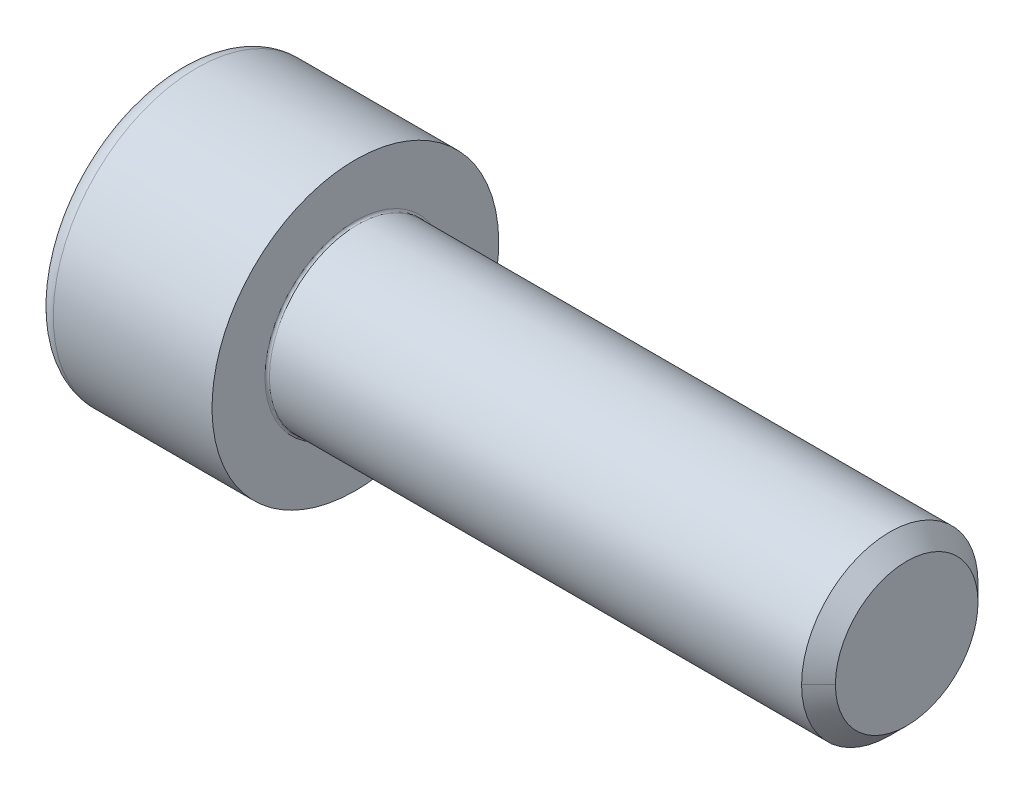
ISO-10303-21;
HEADER;
FILE_DESCRIPTION(('STEP AP214'),'2;1');
FILE_NAME('part.step','',(''),(''),'','','');
FILE_SCHEMA(('AUTOMOTIVE_DESIGN { 1 0 10303 214 1 1 1 1 }'));
ENDSEC;
DATA;
#1=APPLICATION_CONTEXT('core data for automotive mechanical design processes');
#2=APPLICATION_PROTOCOL_DEFINITION('international standard','automotive_design',2000,#1);
#3=PRODUCT_CONTEXT('',#1,'mechanical');
#4=PRODUCT('Part','Part','',(#3));
#5=PRODUCT_RELATED_PRODUCT_CATEGORY('part','',(#4));
#6=PRODUCT_DEFINITION_FORMATION('','',#4);
#7=PRODUCT_DEFINITION_CONTEXT('part definition',#1,'design');
#8=PRODUCT_DEFINITION('design','',#6,#7);
#9=PRODUCT_DEFINITION_SHAPE('','',#8);
#10=(LENGTH_UNIT() NAMED_UNIT(*) SI_UNIT(.MILLI.,.METRE.));
#11=(NAMED_UNIT(*) PLANE_ANGLE_UNIT() SI_UNIT($,.RADIAN.));
#12=(NAMED_UNIT(*) SI_UNIT($,.STERADIAN.) SOLID_ANGLE_UNIT());
#13=UNCERTAINTY_MEASURE_WITH_UNIT(LENGTH_MEASURE(1.E-05),#10,'distance_accuracy_value','');
#14=(GEOMETRIC_REPRESENTATION_CONTEXT(3) GLOBAL_UNCERTAINTY_ASSIGNED_CONTEXT((#13)) GLOBAL_UNIT_ASSIGNED_CONTEXT((#10,
#11,#12)) REPRESENTATION_CONTEXT('',''));
#15=CARTESIAN_POINT('',(0.,0.,0.));
#16=DIRECTION('',(0.,0.,1.));
#17=DIRECTION('',(1.,0.,0.));
#18=AXIS2_PLACEMENT_3D('',#15,#16,#17);
#19=CARTESIAN_POINT('',(-2.,0.,0.));
#20=CARTESIAN_POINT('',(-4.012,0.,-3.484886225));
#21=(BOUNDED_CURVE() B_SPLINE_CURVE(1,(#19,#20),.UNSPECIFIED.,.F.,
.F.) B_SPLINE_CURVE_WITH_KNOTS((2,2),(0.,1.),
.UNSPECIFIED.) CURVE() GEOMETRIC_REPRESENTATION_ITEM() RATIONAL_B_SPLINE_CURVE((1.,1.)) REPRESENTATION_ITEM(''));
#22=CARTESIAN_POINT('',(995.988,0.,0.));
#23=DIRECTION('',(-1.,0.,0.));
#24=AXIS1_PLACEMENT('',#22,#23);
#25=SURFACE_OF_REVOLUTION('',#21,#24);
#26=CARTESIAN_POINT('',(-2.,0.,0.));
#27=VERTEX_POINT('',#26);
#28=VERTEX_LOOP('',#27);
#29=FACE_BOUND('',#28,.T.);
#30=CARTESIAN_POINT('',(-3.99999999984062,-3.,1.73205080735758));
#31=CARTESIAN_POINT('',(-3.97851489193875,-3.,1.65761808052019));
#32=CARTESIAN_POINT('',(-3.95798309838539,-3.,1.58290190663716));
#33=CARTESIAN_POINT('',(-3.91907032719949,-3.,1.43282848850523));
#34=CARTESIAN_POINT('',(-3.90069164714427,-3.,1.35747064985167));
#35=CARTESIAN_POINT('',(-3.8663707665415,-3.,1.20617474089734));
#36=CARTESIAN_POINT('',(-3.85042929047177,-3.,1.13023650508519));
#37=CARTESIAN_POINT('',(-3.82128811879882,-3.,0.977967996741173));
#38=CARTESIAN_POINT('',(-3.8080837718789,-3.,0.901638618944881));
#39=CARTESIAN_POINT('',(-3.78464494856391,-3.,0.748542880651708));
#40=CARTESIAN_POINT('',(-3.77440966493625,-3.,0.671776644726642));
#41=CARTESIAN_POINT('',(-3.75712933263816,-3.,0.517888466866818));
#42=CARTESIAN_POINT('',(-3.75008415629625,-3.,0.440766539292025));
#43=CARTESIAN_POINT('',(-3.73758761921871,-3.,0.260800031229109));
#44=CARTESIAN_POINT('',(-3.73342857884957,-3.,0.157862092212769));
#45=CARTESIAN_POINT('',(-3.73125246220861,-3.,-0.0481162220831747));
#46=CARTESIAN_POINT('',(-3.73323773909754,-3.,-0.151156621496689));
#47=CARTESIAN_POINT('',(-3.74326251019377,-3.,-0.356939780443612));
#48=CARTESIAN_POINT('',(-3.75130205013777,-3.,-0.459682537722608));
#49=CARTESIAN_POINT('',(-3.77307973368925,-3.,-0.66450644773767));
#50=CARTESIAN_POINT('',(-3.78681525038384,-3.,-0.76658788345444));
#51=CARTESIAN_POINT('',(-3.81944899427639,-3.,-0.969910147319328));
#52=CARTESIAN_POINT('',(-3.83834714010404,-3.,-1.07115098869048));
#53=CARTESIAN_POINT('',(-3.88067496383595,-3.,-1.27264427345005));
#54=CARTESIAN_POINT('',(-3.90410334964981,-3.,-1.37289699011778));
#55=CARTESIAN_POINT('',(-3.94053485450444,-3.,-1.51609633056627));
#56=CARTESIAN_POINT('',(-3.95195924232178,-3.,-1.55945231627273));
#57=CARTESIAN_POINT('',(-3.97548303567339,-3.,-1.64591951087093));
#58=CARTESIAN_POINT('',(-3.98758153125938,-3.,-1.68903096714322));
#59=CARTESIAN_POINT('',(-3.99999999990208,-3.,-1.73205080757046));
#60=B_SPLINE_CURVE_WITH_KNOTS('',3,(#30,#31,#32,#33,#34,#35,#36,#37,#38,#39,#40,#41,#42,#43,#44,
#45,#46,#47,#48,#49,#50,#51,#52,#53,#54,#55,#56,#57,#58,#59),.UNSPECIFIED.,.F.,.F.,(4,2,2,2,2,2,
2,2,2,2,2,2,2,2,4),(0.,0.232420113380513,0.465086024657071,0.697820963770005,0.93015710451819,
1.16243001809751,1.39469363504717,1.70357230484059,2.01256928413323,2.32156859775501,
2.63042556298281,2.93927766047031,3.24804179842969,3.38254521310348,3.51687127037881),.UNSPECIFIED.);
#61=CARTESIAN_POINT('',(-3.99999999992627,-2.99999999997875,1.73205080769106));
#62=VERTEX_POINT('',#61);
#63=CARTESIAN_POINT('',(-3.99999999962119,-2.99999999988657,-1.73205080806549));
#64=VERTEX_POINT('',#63);
#65=EDGE_CURVE('E135',#62,#64,#60,.T.);
#66=ORIENTED_EDGE('',*,*,#65,.F.);
#67=CARTESIAN_POINT('',(-3.99999999957588,-7.38635641571954E-10,3.46410161457355));
#68=CARTESIAN_POINT('',(-3.97851489168713,-0.0644606330526756,3.42688525116713));
#69=CARTESIAN_POINT('',(-3.95798309814725,-0.129166737708852,3.38952716423794));
#70=CARTESIAN_POINT('',(-3.91907032698901,-0.259134130243514,3.31449045519683));
#71=CARTESIAN_POINT('',(-3.90069164694797,-0.32439593289154,3.27681153588256));
#72=CARTESIAN_POINT('',(-3.86637076637425,-0.455422033533953,3.20116358143065));
#73=CARTESIAN_POINT('',(-3.8504292903194,-0.521186474865402,3.1631944635373));
#74=CARTESIAN_POINT('',(-3.82128811867685,-0.653054871285987,3.08706020939127));
#75=CARTESIAN_POINT('',(-3.80808377177244,-0.719158051511383,3.04889552050639));
#76=CARTESIAN_POINT('',(-3.78464494848871,-0.851742850081483,2.97234765138663));
#77=CARTESIAN_POINT('',(-3.7744096648768,-0.918224360543831,2.93396453343767));
#78=CARTESIAN_POINT('',(-3.75712933261013,-1.05149543190867,2.85702044453526));
#79=CARTESIAN_POINT('',(-3.7500841562839,-1.11828498037507,2.8184594807618));
#80=CARTESIAN_POINT('',(-3.73758761924036,-1.27414054820655,2.72847622674914));
#81=CARTESIAN_POINT('',(-3.73342857889102,-1.36328741842863,2.67700725724592));
#82=CARTESIAN_POINT('',(-3.73125246229145,-1.541669871278,2.57401810010845));
#83=CARTESIAN_POINT('',(-3.733237739202,-1.63090547480589,2.52249790040725));
#84=CARTESIAN_POINT('',(-3.74326251034196,-1.80911891816321,2.41960632094548));
#85=CARTESIAN_POINT('',(-3.75130205030807,-1.89809675604027,2.36823494231212));
#86=CARTESIAN_POINT('',(-3.77307973390372,-2.07547946545202,2.2658229873173));
#87=CARTESIAN_POINT('',(-3.78681525062037,-2.16388458205519,2.21478226946549));
#88=CARTESIAN_POINT('',(-3.81944899455595,-2.33996682775162,2.11312113754653));
#89=CARTESIAN_POINT('',(-3.83834714040457,-2.42764396829638,2.06250071686786));
#90=CARTESIAN_POINT('',(-3.88067496417706,-2.60214227162324,1.96175407450205));
#91=CARTESIAN_POINT('',(-3.90410335001053,-2.68896367107218,1.91162771617525));
#92=CARTESIAN_POINT('',(-3.94053485484528,-2.81297793756851,1.84002804605376));
#93=CARTESIAN_POINT('',(-3.95195924262051,-2.85052532244375,1.81835005329579));
#94=CARTESIAN_POINT('',(-3.97548303588198,-2.9254081092561,1.77511645618621));
#95=CARTESIAN_POINT('',(-3.98758153141995,-2.96274372543106,1.75356072814432));
#96=CARTESIAN_POINT('',(-4.00000000001191,-2.99999999995749,1.73205080802454));
#97=B_SPLINE_CURVE_WITH_KNOTS('',3,(#67,#68,#69,#70,#71,#72,#73,#74,#75,#76,#77,#78,#79,#80,#81,
#82,#83,#84,#85,#86,#87,#88,#89,#90,#91,#92,#93,#94,#95,#96),.UNSPECIFIED.,.F.,.F.,(4,2,2,2,2,2,
2,2,2,2,2,2,2,2,4),(0.,0.232420113351682,0.465086024599276,0.697820963683193,0.930157104400625,
1.16243001794921,1.3946936348681,1.70357230470536,2.012569284042,2.32156859770795,
2.6304255629803,2.93927766051221,3.24804179851589,3.38254521263582,3.5168712693585),.UNSPECIFIED.);
#98=CARTESIAN_POINT('',(-3.99999999979384,-7.104993349707E-10,3.46410161541021));
#99=VERTEX_POINT('',#98);
#100=EDGE_CURVE('E57',#99,#62,#97,.T.);
#101=ORIENTED_EDGE('',*,*,#100,.F.);
#102=CARTESIAN_POINT('',(-4.00000000005976,3.00000000010105,1.73205080794166));
#103=CARTESIAN_POINT('',(-3.97851489215166,2.93553936777582,1.76926717135454));
#104=CARTESIAN_POINT('',(-3.95798309859197,2.8708332631084,1.80662525829022));
#105=CARTESIAN_POINT('',(-3.91907032739323,2.74086587055095,1.88166196734449));
#106=CARTESIAN_POINT('',(-3.90069164733149,2.67560406789139,1.91934088666541));
#107=CARTESIAN_POINT('',(-3.86637076671553,2.54457796722554,1.99498884113086));
#108=CARTESIAN_POINT('',(-3.85042929063914,2.47881352588219,2.03295795903108));
#109=CARTESIAN_POINT('',(-3.82128811895272,2.34694512943654,2.10909221319157));
#110=CARTESIAN_POINT('',(-3.808083772026,2.28084194919798,2.14725690208406));
#111=CARTESIAN_POINT('',(-3.78464494869751,2.14825715060089,2.2238047712194));
#112=CARTESIAN_POINT('',(-3.77440966506314,2.08177564012473,2.26218788917634));
#113=CARTESIAN_POINT('',(-3.75712933275194,1.94850456873147,2.33913197809515));
#114=CARTESIAN_POINT('',(-3.75008415640363,1.88171502025047,2.37769294187705));
#115=CARTESIAN_POINT('',(-3.73758761931226,1.72585945241781,2.46767619589038));
#116=CARTESIAN_POINT('',(-3.73342857893519,1.636712582209,2.51914516538595));
#117=CARTESIAN_POINT('',(-3.73125246227814,1.45833012938471,2.62213432250893));
#118=CARTESIAN_POINT('',(-3.73323773915892,1.36909452586866,2.6736545222033));
#119=CARTESIAN_POINT('',(-3.74326251023896,1.19088108253351,2.77654610165227));
#120=CARTESIAN_POINT('',(-3.75130205017491,1.1019032446668,2.82791748027965));
#121=CARTESIAN_POINT('',(-3.77307973371073,0.924520535274668,2.93032943526315));
#122=CARTESIAN_POINT('',(-3.78681525039768,0.836115418680768,2.98137015310961));
#123=CARTESIAN_POINT('',(-3.81944899427565,0.660033173001847,3.08303128501846));
#124=CARTESIAN_POINT('',(-3.83834714009636,0.572356032465338,3.13365170569236));
#125=CARTESIAN_POINT('',(-3.88067496381504,0.397857729154355,3.234398348049));
#126=CARTESIAN_POINT('',(-3.90410334962262,0.311036329713043,3.2845247063714));
#127=CARTESIAN_POINT('',(-3.94053485447622,0.187022063042391,3.35612437659354));
#128=CARTESIAN_POINT('',(-3.9519592422989,0.149474677986129,3.37780236945602));
#129=CARTESIAN_POINT('',(-3.97548303566214,0.0745918908136653,3.42103596677351));
#130=CARTESIAN_POINT('',(-3.98758153125442,0.0372562744596169,3.4425916949188));
#131=CARTESIAN_POINT('',(-3.9999999999038,-2.45131167179603E-10,3.46410161514153));
#132=B_SPLINE_CURVE_WITH_KNOTS('',3,(#102,#103,#104,#105,#106,#107,#108,#109,#110,#111,#112,
#113,#114,#115,#116,#117,#118,#119,#120,#121,#122,#123,#124,#125,#126,#127,#128,#129,#130,#131),
.UNSPECIFIED.,.F.,.F.,(4,2,2,2,2,2,2,2,2,2,2,2,2,2,4),(0.,0.232420113405036,0.465086024706195,
0.697820963843758,0.930157104617576,1.16243001822251,1.39469363519779,1.70357230499265,
2.01256928428666,2.32156859790978,2.63042556313837,2.93927766062672,3.24804179858691,
3.38254521334941,3.51687127071333),.UNSPECIFIED.);
#133=CARTESIAN_POINT('',(-3.99999999967584,3.00000000005053,1.73205080797083));
#134=VERTEX_POINT('',#133);
#135=EDGE_CURVE('E555',#134,#99,#132,.T.);
#136=ORIENTED_EDGE('',*,*,#135,.F.);
#137=CARTESIAN_POINT('',(-3.99999999994993,3.,-1.73205080773623));
#138=CARTESIAN_POINT('',(-3.97851489204373,3.,-1.65761808089599));
#139=CARTESIAN_POINT('',(-3.95798309848593,3.,-1.58290190701009));
#140=CARTESIAN_POINT('',(-3.91907032729093,3.,-1.43282848887236));
#141=CARTESIAN_POINT('',(-3.90069164723105,3.,-1.35747065021586));
#142=CARTESIAN_POINT('',(-3.86637076661874,3.,-1.20617474125556));
#143=CARTESIAN_POINT('',(-3.85042929054414,3.,-1.13023650544038));
#144=CARTESIAN_POINT('',(-3.82128811886125,3.,-0.977967997089835));
#145=CARTESIAN_POINT('',(-3.80808377193626,3.,-0.901638619290043));
#146=CARTESIAN_POINT('',(-3.78464494861112,3.,-0.748542880989702));
#147=CARTESIAN_POINT('',(-3.77440966497836,3.,-0.671776645060969));
#148=CARTESIAN_POINT('',(-3.75712933267019,3.,-0.5178884671936));
#149=CARTESIAN_POINT('',(-3.75008415632331,3.,-0.440766539614931));
#150=CARTESIAN_POINT('',(-3.73758761923494,3.,-0.26080003155157));
#151=CARTESIAN_POINT('',(-3.73342857885949,3.,-0.157862092538618));
#152=CARTESIAN_POINT('',(-3.73125246220557,3.,0.048116221750925));
#153=CARTESIAN_POINT('',(-3.73323773908787,3.,0.151156621161426));
#154=CARTESIAN_POINT('',(-3.74326251017062,3.,0.356939780102711));
#155=CARTESIAN_POINT('',(-3.75130205010776,3.,0.459682537379084));
#156=CARTESIAN_POINT('',(-3.77307973364571,3.,0.664506447389037));
#157=CARTESIAN_POINT('',(-3.78681525033359,3.,0.766587883103323));
#158=CARTESIAN_POINT('',(-3.81944899421315,3.,0.969910146963494));
#159=CARTESIAN_POINT('',(-3.83834714003452,3.,1.07115098833242));
#160=CARTESIAN_POINT('',(-3.88067496375425,3.,1.27264427308768));
#161=CARTESIAN_POINT('',(-3.90410334956221,3.,1.37289698975335));
#162=CARTESIAN_POINT('',(-3.94053485440846,3.,1.51609633019774));
#163=CARTESIAN_POINT('',(-3.95195924222308,3.,1.55945231590215));
#164=CARTESIAN_POINT('',(-3.97548303556933,3.,1.64591951049628));
#165=CARTESIAN_POINT('',(-3.98758153115268,3.,1.68903096676657));
#166=CARTESIAN_POINT('',(-3.99999999979277,3.,1.73205080719181));
#167=B_SPLINE_CURVE_WITH_KNOTS('',3,(#137,#138,#139,#140,#141,#142,#143,#144,#145,#146,#147,
#148,#149,#150,#151,#152,#153,#154,#155,#156,#157,#158,#159,#160,#161,#162,#163,#164,#165,#166),
.UNSPECIFIED.,.F.,.F.,(4,2,2,2,2,2,2,2,2,2,2,2,2,2,4),(0.,0.232420113392348,0.465086024680793,
0.697820963805631,0.930157104566755,1.162430018159,1.3946936351216,1.70357230490566,
2.01256928418888,2.32156859780122,2.63042556301892,2.93927766049637,3.24804179844566,
3.38254521311141,3.51687127037881),.UNSPECIFIED.);
#168=CARTESIAN_POINT('',(-3.99999999962093,3.,-1.73205080786812));
#169=VERTEX_POINT('',#168);
#170=EDGE_CURVE('E149',#169,#134,#167,.T.);
#171=ORIENTED_EDGE('',*,*,#170,.F.);
#172=CARTESIAN_POINT('',(-3.99999999977573,1.39081131062023E-10,-3.4641016149197));
#173=CARTESIAN_POINT('',(-3.97851489187896,0.0644606324576882,-3.42688525151064));
#174=CARTESIAN_POINT('',(-3.95798309833089,0.129166737118463,-3.3895271645788));
#175=CARTESIAN_POINT('',(-3.91907032715594,0.259134129662445,-3.31449045553231));
#176=CARTESIAN_POINT('',(-3.90069164710637,0.324395932315195,-3.27681153621532));
#177=CARTESIAN_POINT('',(-3.86637076651528,0.455422032967204,-3.20116358175786));
#178=CARTESIAN_POINT('',(-3.85042929045156,0.521186474303528,-3.1631944638617));
#179=CARTESIAN_POINT('',(-3.82128811879087,0.653054870734463,-3.0870602097097));
#180=CARTESIAN_POINT('',(-3.80808377187718,0.719158050965336,-3.04889552082165));
#181=CARTESIAN_POINT('',(-3.78464494857491,0.851742849546664,-2.97234765169541));
#182=CARTESIAN_POINT('',(-3.77440966495372,0.918224360014764,-2.93396453374312));
#183=CARTESIAN_POINT('',(-3.75712933266867,1.05149543139143,-2.85702044483389));
#184=CARTESIAN_POINT('',(-3.75008415633333,1.11828497986391,-2.81845948105691));
#185=CARTESIAN_POINT('',(-3.73758761927009,1.27414054769598,-2.72847622704392));
#186=CARTESIAN_POINT('',(-3.73342857890934,1.36328741791262,-2.67700725754384));
#187=CARTESIAN_POINT('',(-3.73125246228605,1.54166987075173,-2.57401810041229));
#188=CARTESIAN_POINT('',(-3.73323773918426,1.63090547427478,-2.52249790071388));
#189=CARTESIAN_POINT('',(-3.74326251029949,1.80911891762304,-2.41960632125735));
#190=CARTESIAN_POINT('',(-3.75130205025319,1.89809675549587,-2.36823494262643));
#191=CARTESIAN_POINT('',(-3.7730797338241,2.07547946489953,-2.26582298763628));
#192=CARTESIAN_POINT('',(-3.78681525052841,2.16388458149883,-2.2147822697867));
#193=CARTESIAN_POINT('',(-3.81944899444012,2.33996682718795,-2.11312113787196));
#194=CARTESIAN_POINT('',(-3.8383471402772,2.42764396772925,-2.06250071719529));
#195=CARTESIAN_POINT('',(-3.88067496402752,2.60214227104944,-1.96175407483333));
#196=CARTESIAN_POINT('',(-3.90410334985036,2.68896367049516,-1.91162771650839));
#197=CARTESIAN_POINT('',(-3.94053485468325,2.81297793703079,-1.84002804636421));
#198=CARTESIAN_POINT('',(-3.9519592424678,2.8505253219483,-1.81835005358184));
#199=CARTESIAN_POINT('',(-3.97548303574968,2.92540810884473,-1.77511645642371));
#200=CARTESIAN_POINT('',(-3.98758153129873,2.96274372506151,-1.75356072835767));
#201=CARTESIAN_POINT('',(-3.9999999999026,2.99999999962957,-1.73205080821387));
#202=B_SPLINE_CURVE_WITH_KNOTS('',3,(#172,#173,#174,#175,#176,#177,#178,#179,#180,#181,#182,
#183,#184,#185,#186,#187,#188,#189,#190,#191,#192,#193,#194,#195,#196,#197,#198,#199,#200,#201),
.UNSPECIFIED.,.F.,.F.,(4,2,2,2,2,2,2,2,2,2,2,2,2,2,4),(0.,0.23242011337356,0.46508602464312,
0.697820963749038,0.930157104489918,1.16243001806193,1.39469363500427,1.70357230482418,
2.01256928414338,2.32156859779182,2.63042556304594,2.93927766055969,3.24804179854522,
3.38254521281383,3.51687126968495),.UNSPECIFIED.);
#203=CARTESIAN_POINT('',(-3.99999999969522,-2.41512716785092E-10,-3.46410161478026));
#204=VERTEX_POINT('',#203);
#205=EDGE_CURVE('E130',#204,#169,#202,.T.);
#206=ORIENTED_EDGE('',*,*,#205,.F.);
#207=CARTESIAN_POINT('',(-3.99999999995045,-2.99999999977313,-1.73205080813098));
#208=CARTESIAN_POINT('',(-3.97851489204676,-2.93553936745059,-1.76926717154231));
#209=CARTESIAN_POINT('',(-3.95798309849157,-2.87083326278586,-1.80662525847644));
#210=CARTESIAN_POINT('',(-3.91907032730202,-2.74086587023388,-1.88166196752755));
#211=CARTESIAN_POINT('',(-3.90069164724498,-2.67560406757708,-1.91934088684688));
#212=CARTESIAN_POINT('',(-3.86637076663864,-2.54457796691684,-1.99498884130909));
#213=CARTESIAN_POINT('',(-3.85042929056716,-2.47881352557633,-2.03295795920767));
#214=CARTESIAN_POINT('',(-3.82128811889062,-2.34694512913635,-2.10909221336489));
#215=CARTESIAN_POINT('',(-3.80808377196888,-2.28084194890061,-2.14725690225575));
#216=CARTESIAN_POINT('',(-3.78464494865043,-2.14825715030931,-2.22380477138774));
#217=CARTESIAN_POINT('',(-3.77440966502113,-2.08177563983612,-2.26218788934297));
#218=CARTESIAN_POINT('',(-3.75712933271995,-1.94850456844897,-2.33913197825826));
#219=CARTESIAN_POINT('',(-3.75008415637659,-1.88171501997111,-2.37769294203834));
#220=CARTESIAN_POINT('',(-3.73758761929602,-1.7258594521384,-2.4676761960517));
#221=CARTESIAN_POINT('',(-3.73342857892526,-1.63671258192642,-2.5191451655491));
#222=CARTESIAN_POINT('',(-3.73125246228124,-1.45833012909613,-2.62213432267554));
#223=CARTESIAN_POINT('',(-3.73323773916874,-1.36909452557723,-2.67365452237156));
#224=CARTESIAN_POINT('',(-3.74326251026237,-1.19088108223674,-2.77654610182361));
#225=CARTESIAN_POINT('',(-3.75130205020518,-1.10190324436752,-2.82791748045244));
#226=CARTESIAN_POINT('',(-3.77307973375454,-0.924520534970937,-2.93032943543851));
#227=CARTESIAN_POINT('',(-3.78681525044816,-0.836115418375098,-2.98137015328609));
#228=CARTESIAN_POINT('',(-3.81944899433907,-0.660033172692536,-3.08303128519704));
#229=CARTESIAN_POINT('',(-3.83834714016604,-0.572356032154325,-3.13365170587193));
#230=CARTESIAN_POINT('',(-3.88067496389687,-0.397857728840117,-3.23439834823043));
#231=CARTESIAN_POINT('',(-3.90410334971033,-0.311036329397281,-3.28452470655371));
#232=CARTESIAN_POINT('',(-3.94053485452629,-0.187022062879447,-3.35612437668762));
#233=CARTESIAN_POINT('',(-3.95195924230272,-0.149474677976829,-3.37780236946139));
#234=CARTESIAN_POINT('',(-3.97548303556803,-0.0745918911099563,-3.42103596660245));
#235=CARTESIAN_POINT('',(-3.98758153110865,-0.0372562749078564,-3.44259169466001));
#236=CARTESIAN_POINT('',(-3.99999999970395,-3.5442287033759E-10,-3.46410161479537));
#237=B_SPLINE_CURVE_WITH_KNOTS('',3,(#207,#208,#209,#210,#211,#212,#213,#214,#215,#216,#217,
#218,#219,#220,#221,#222,#223,#224,#225,#226,#227,#228,#229,#230,#231,#232,#233,#234,#235,#236),
.UNSPECIFIED.,.F.,.F.,(4,2,2,2,2,2,2,2,2,2,2,2,2,2,4),(0.,0.232420113392433,0.465086024680942,
0.697820963805839,0.930157104567463,1.16243001816021,1.39469363512329,1.7035723049283,
2.01256928423252,2.32156859786593,2.63042556310386,2.93927766060147,3.24804179857082,
3.38254521278336,3.51687126959869),.UNSPECIFIED.);
#238=EDGE_CURVE('E136',#64,#204,#237,.T.);
#239=ORIENTED_EDGE('',*,*,#238,.F.);
#240=EDGE_LOOP('',(#66,#101,#136,#171,#206,#239));
#241=FACE_BOUND('',#240,.T.);
#242=ADVANCED_FACE('F53',(#29,#241),#25,.F.);
#243=CARTESIAN_POINT('',(-8.,-3.,1.732050808));
#244=DIRECTION('',(0.,-0.499999999876834,0.866025403855548));
#245=DIRECTION('',(0.,0.866025403855548,0.499999999876834));
#246=AXIS2_PLACEMENT_3D('',#243,#244,#245);
#247=PLANE('',#246);
#248=DIRECTION('',(0.,0.866025403855548,0.499999999876834));
#249=VECTOR('',#248,1.);
#250=CARTESIAN_POINT('',(-8.,-3.00000000267375,1.73205080645631));
#251=LINE('',#250,#249);
#252=CARTESIAN_POINT('',(-8.,-3.,1.732050808));
#253=VERTEX_POINT('',#252);
#254=CARTESIAN_POINT('',(-8.,0.,3.464101615));
#255=VERTEX_POINT('',#254);
#256=EDGE_CURVE('E263',#253,#255,#251,.T.);
#257=ORIENTED_EDGE('',*,*,#256,.T.);
#258=DIRECTION('',(1.,0.,0.));
#259=VECTOR('',#258,1.);
#260=CARTESIAN_POINT('',(-8.,0.,3.464101615));
#261=LINE('',#260,#259);
#262=EDGE_CURVE('E552',#99,#255,#261,.F.);
#263=ORIENTED_EDGE('',*,*,#262,.F.);
#264=ORIENTED_EDGE('',*,*,#100,.T.);
#265=DIRECTION('',(1.,0.,0.));
#266=VECTOR('',#265,1.);
#267=CARTESIAN_POINT('',(-8.,-3.,1.732050808));
#268=LINE('',#267,#266);
#269=EDGE_CURVE('E266',#253,#62,#268,.T.);
#270=ORIENTED_EDGE('',*,*,#269,.F.);
#271=EDGE_LOOP('',(#257,#263,#264,#270));
#272=FACE_BOUND('',#271,.T.);
#273=ADVANCED_FACE('F168',(#272),#247,.F.);
#274=CARTESIAN_POINT('',(-8.,0.,3.464101615));
#275=DIRECTION('',(0.,0.499999999876834,0.866025403855548));
#276=DIRECTION('',(0.,0.866025403855548,-0.499999999876834));
#277=AXIS2_PLACEMENT_3D('',#274,#275,#276);
#278=PLANE('',#277);
#279=DIRECTION('',(0.,0.866025403855548,-0.499999999876835));
#280=VECTOR('',#279,1.);
#281=CARTESIAN_POINT('',(-8.,-3.39808736704583E-09,3.46410161696189));
#282=LINE('',#281,#280);
#283=CARTESIAN_POINT('',(-8.,3.,1.732050808));
#284=VERTEX_POINT('',#283);
#285=EDGE_CURVE('E260',#255,#284,#282,.T.);
#286=ORIENTED_EDGE('',*,*,#285,.T.);
#287=DIRECTION('',(1.,0.,0.));
#288=VECTOR('',#287,1.);
#289=CARTESIAN_POINT('',(-8.,3.,1.732050808));
#290=LINE('',#289,#288);
#291=EDGE_CURVE('E150',#134,#284,#290,.F.);
#292=ORIENTED_EDGE('',*,*,#291,.F.);
#293=ORIENTED_EDGE('',*,*,#135,.T.);
#294=ORIENTED_EDGE('',*,*,#262,.T.);
#295=EDGE_LOOP('',(#286,#292,#293,#294));
#296=FACE_BOUND('',#295,.T.);
#297=ADVANCED_FACE('F391',(#296),#278,.F.);
#298=CARTESIAN_POINT('',(-8.,3.,1.732050808));
#299=DIRECTION('',(0.,1.,0.));
#300=DIRECTION('',(0.,0.,-1.));
#301=AXIS2_PLACEMENT_3D('',#298,#299,#300);
#302=PLANE('',#301);
#303=DIRECTION('',(0.,0.,-1.));
#304=VECTOR('',#303,1.);
#305=CARTESIAN_POINT('',(-8.,3.,5.768424596));
#306=LINE('',#305,#304);
#307=CARTESIAN_POINT('',(-8.,3.,-1.732050808));
#308=VERTEX_POINT('',#307);
#309=EDGE_CURVE('E257',#284,#308,#306,.T.);
#310=ORIENTED_EDGE('',*,*,#309,.T.);
#311=DIRECTION('',(1.,0.,0.));
#312=VECTOR('',#311,1.);
#313=CARTESIAN_POINT('',(-8.,3.,-1.732050808));
#314=LINE('',#313,#312);
#315=EDGE_CURVE('E145',#169,#308,#314,.F.);
#316=ORIENTED_EDGE('',*,*,#315,.F.);
#317=ORIENTED_EDGE('',*,*,#170,.T.);
#318=ORIENTED_EDGE('',*,*,#291,.T.);
#319=EDGE_LOOP('',(#310,#316,#317,#318));
#320=FACE_BOUND('',#319,.T.);
#321=ADVANCED_FACE('F382',(#320),#302,.F.);
#322=CARTESIAN_POINT('',(-8.,3.,-1.732050808));
#323=DIRECTION('',(0.,0.499999999876834,-0.866025403855548));
#324=DIRECTION('',(0.,-0.866025403855548,-0.499999999876834));
#325=AXIS2_PLACEMENT_3D('',#322,#323,#324);
#326=PLANE('',#325);
#327=DIRECTION('',(0.,-0.866025403855548,-0.499999999876834));
#328=VECTOR('',#327,1.);
#329=CARTESIAN_POINT('',(-8.,2.9999999970882,-1.73205080968113));
#330=LINE('',#329,#328);
#331=CARTESIAN_POINT('',(-8.,0.,-3.464101615));
#332=VERTEX_POINT('',#331);
#333=EDGE_CURVE('E132',#308,#332,#330,.T.);
#334=ORIENTED_EDGE('',*,*,#333,.T.);
#335=DIRECTION('',(1.,0.,0.));
#336=VECTOR('',#335,1.);
#337=CARTESIAN_POINT('',(-8.,0.,-3.464101615));
#338=LINE('',#337,#336);
#339=EDGE_CURVE('E125',#204,#332,#338,.F.);
#340=ORIENTED_EDGE('',*,*,#339,.F.);
#341=ORIENTED_EDGE('',*,*,#205,.T.);
#342=ORIENTED_EDGE('',*,*,#315,.T.);
#343=EDGE_LOOP('',(#334,#340,#341,#342));
#344=FACE_BOUND('',#343,.T.);
#345=ADVANCED_FACE('F127',(#344),#326,.F.);
#346=CARTESIAN_POINT('',(-8.,0.,-3.464101615));
#347=DIRECTION('',(0.,-0.499999999876834,-0.866025403855548));
#348=DIRECTION('',(0.,-0.866025403855548,0.499999999876834));
#349=AXIS2_PLACEMENT_3D('',#346,#347,#348);
#350=PLANE('',#349);
#351=DIRECTION('',(0.,-0.866025403855548,0.499999999876835));
#352=VECTOR('',#351,1.);
#353=CARTESIAN_POINT('',(-8.,-2.18746375180157E-09,-3.46410161373707));
#354=LINE('',#353,#352);
#355=CARTESIAN_POINT('',(-8.,-3.,-1.732050808));
#356=VERTEX_POINT('',#355);
#357=EDGE_CURVE('E254',#332,#356,#354,.T.);
#358=ORIENTED_EDGE('',*,*,#357,.T.);
#359=DIRECTION('',(1.,0.,0.));
#360=VECTOR('',#359,1.);
#361=CARTESIAN_POINT('',(-8.,-3.,-1.732050808));
#362=LINE('',#361,#360);
#363=EDGE_CURVE('E141',#64,#356,#362,.F.);
#364=ORIENTED_EDGE('',*,*,#363,.F.);
#365=ORIENTED_EDGE('',*,*,#238,.T.);
#366=ORIENTED_EDGE('',*,*,#339,.T.);
#367=EDGE_LOOP('',(#358,#364,#365,#366));
#368=FACE_BOUND('',#367,.T.);
#369=ADVANCED_FACE('F139',(#368),#350,.F.);
#370=CARTESIAN_POINT('',(-8.,-3.,-1.732050808));
#371=DIRECTION('',(0.,-1.,0.));
#372=DIRECTION('',(0.,0.,1.));
#373=AXIS2_PLACEMENT_3D('',#370,#371,#372);
#374=PLANE('',#373);
#375=DIRECTION('',(0.,0.,-1.));
#376=VECTOR('',#375,1.);
#377=CARTESIAN_POINT('',(-8.,-3.,5.768424596));
#378=LINE('',#377,#376);
#379=EDGE_CURVE('E250',#356,#253,#378,.F.);
#380=ORIENTED_EDGE('',*,*,#379,.T.);
#381=ORIENTED_EDGE('',*,*,#269,.T.);
#382=ORIENTED_EDGE('',*,*,#65,.T.);
#383=ORIENTED_EDGE('',*,*,#363,.T.);
#384=EDGE_LOOP('',(#380,#381,#382,#383));
#385=FACE_BOUND('',#384,.T.);
#386=ADVANCED_FACE('F274',(#385),#374,.F.);
#387=CARTESIAN_POINT('',(-8.,5.768400146,5.768424596));
#388=DIRECTION('',(-1.,0.,0.));
#389=DIRECTION('',(0.,-1.,0.));
#390=AXIS2_PLACEMENT_3D('',#387,#388,#389);
#391=PLANE('',#390);
#392=ORIENTED_EDGE('',*,*,#357,.F.);
#393=ORIENTED_EDGE('',*,*,#333,.F.);
#394=ORIENTED_EDGE('',*,*,#309,.F.);
#395=ORIENTED_EDGE('',*,*,#285,.F.);
#396=ORIENTED_EDGE('',*,*,#256,.F.);
#397=ORIENTED_EDGE('',*,*,#379,.F.);
#398=EDGE_LOOP('',(#392,#393,#394,#395,#396,#397));
#399=FACE_BOUND('',#398,.T.);
#400=CARTESIAN_POINT('',(-8.,0.,0.));
#401=DIRECTION('',(-1.,0.,0.));
#402=DIRECTION('',(0.,1.,0.));
#403=AXIS2_PLACEMENT_3D('',#400,#401,#402);
#404=CIRCLE('',#403,5.7);
#405=CARTESIAN_POINT('',(-7.99999999999999,5.7,0.));
#406=VERTEX_POINT('',#405);
#407=EDGE_CURVE('E246',#406,#406,#404,.T.);
#408=ORIENTED_EDGE('',*,*,#407,.T.);
#409=EDGE_LOOP('',(#408));
#410=FACE_BOUND('',#409,.T.);
#411=ADVANCED_FACE('F278',(#399,#410),#391,.T.);
#412=CARTESIAN_POINT('',(25.,-3.27198575,3.27198575));
#413=DIRECTION('',(1.,0.,0.));
#414=DIRECTION('',(0.,1.,0.));
#415=AXIS2_PLACEMENT_3D('',#412,#413,#414);
#416=PLANE('',#415);
#417=CARTESIAN_POINT('',(25.,0.,0.));
#418=DIRECTION('',(1.,0.,0.));
#419=DIRECTION('',(0.,0.,-1.));
#420=AXIS2_PLACEMENT_3D('',#417,#418,#419);
#421=CIRCLE('',#420,3.2331875);
#422=CARTESIAN_POINT('',(25.,-1.10522973555052E-09,3.23318750001645));
#423=VERTEX_POINT('',#422);
#424=CARTESIAN_POINT('',(25.,-9.67727337469207E-11,-3.23318750001645));
#425=VERTEX_POINT('',#424);
#426=EDGE_CURVE('E244',#423,#425,#421,.F.);
#427=ORIENTED_EDGE('',*,*,#426,.F.);
#428=CARTESIAN_POINT('',(25.,0.,0.));
#429=DIRECTION('',(1.,0.,0.));
#430=DIRECTION('',(0.,0.,-1.));
#431=AXIS2_PLACEMENT_3D('',#428,#429,#430);
#432=CIRCLE('',#431,3.2331875);
#433=EDGE_CURVE('E236',#425,#423,#432,.F.);
#434=ORIENTED_EDGE('',*,*,#433,.F.);
#435=EDGE_LOOP('',(#427,#434));
#436=FACE_BOUND('',#435,.T.);
#437=ADVANCED_FACE('F245',(#436),#416,.T.);
#438=CARTESIAN_POINT('',(-7.2,0.,0.));
#439=DIRECTION('',(1.,0.,0.));
#440=DIRECTION('',(0.,1.,0.));
#441=AXIS2_PLACEMENT_3D('',#438,#439,#440);
#442=TOROIDAL_SURFACE('',#441,5.7,0.800000000000002);
#443=ORIENTED_EDGE('',*,*,#407,.F.);
#444=EDGE_LOOP('',(#443));
#445=FACE_BOUND('',#444,.T.);
#446=CARTESIAN_POINT('',(-7.2,0.,0.));
#447=DIRECTION('',(-1.,0.,0.));
#448=DIRECTION('',(0.,1.,0.));
#449=AXIS2_PLACEMENT_3D('',#446,#447,#448);
#450=CIRCLE('',#449,6.5);
#451=CARTESIAN_POINT('',(-7.2,6.5,0.));
#452=VERTEX_POINT('',#451);
#453=EDGE_CURVE('E293',#452,#452,#450,.F.);
#454=ORIENTED_EDGE('',*,*,#453,.F.);
#455=EDGE_LOOP('',(#454));
#456=FACE_BOUND('',#455,.T.);
#457=ADVANCED_FACE('F232',(#445,#456),#442,.T.);
#458=CARTESIAN_POINT('',(25.0001414213562,0.,-3.23304607864377));
#459=CARTESIAN_POINT('',(25.,0.,-3.2331875));
#460=CARTESIAN_POINT('',(24.2331875,0.,-4.));
#461=(BOUNDED_CURVE() B_SPLINE_CURVE(1,(#458,#459,#460),.UNSPECIFIED.,.F.,
.F.) B_SPLINE_CURVE_WITH_KNOTS((2,1,2),(-0.000184427512764662,4.44687168424251E-11,1.),
.UNSPECIFIED.) CURVE() GEOMETRIC_REPRESENTATION_ITEM() RATIONAL_B_SPLINE_CURVE((1.,1.,1.)) REPRESENTATION_ITEM(''));
#462=CARTESIAN_POINT('',(1024.2331875,0.,0.));
#463=DIRECTION('',(-1.,0.,0.));
#464=AXIS1_PLACEMENT('',#462,#463);
#465=SURFACE_OF_REVOLUTION('',#461,#464);
#466=DIRECTION('',(-0.707106781216905,-2.90060050283392E-10,0.70710678115619));
#467=VECTOR('',#466,1.);
#468=CARTESIAN_POINT('',(24.6166644606781,-1.48352254933921E-09,3.61652303932188));
#469=LINE('',#468,#467);
#470=CARTESIAN_POINT('',(24.2331875,-1.64082742811598E-09,3.99999999998358));
#471=VERTEX_POINT('',#470);
#472=EDGE_CURVE('E238',#423,#471,#469,.T.);
#473=ORIENTED_EDGE('',*,*,#472,.F.);
#474=ORIENTED_EDGE('',*,*,#426,.T.);
#475=DIRECTION('',(0.707106781216905,0.,0.70710678115619));
#476=VECTOR('',#475,1.);
#477=CARTESIAN_POINT('',(24.6166644606781,0.,-3.61652303932188));
#478=LINE('',#477,#476);
#479=CARTESIAN_POINT('',(24.2331875,-3.59172737358093E-10,-3.99999999998358));
#480=VERTEX_POINT('',#479);
#481=EDGE_CURVE('E240',#480,#425,#478,.T.);
#482=ORIENTED_EDGE('',*,*,#481,.F.);
#483=CARTESIAN_POINT('',(24.2331874999999,0.,0.));
#484=DIRECTION('',(1.,0.,0.));
#485=DIRECTION('',(0.,0.,-1.));
#486=AXIS2_PLACEMENT_3D('',#483,#484,#485);
#487=CIRCLE('',#486,4.);
#488=EDGE_CURVE('E294',#471,#480,#487,.F.);
#489=ORIENTED_EDGE('',*,*,#488,.F.);
#490=EDGE_LOOP('',(#473,#474,#482,#489));
#491=FACE_BOUND('',#490,.T.);
#492=ADVANCED_FACE('F170',(#491),#465,.T.);
#493=CARTESIAN_POINT('',(25.,0.,-3.2331875));
#494=CARTESIAN_POINT('',(24.2331875,0.,-4.));
#495=(BOUNDED_CURVE() B_SPLINE_CURVE(1,(#493,#494),.UNSPECIFIED.,.F.,
.F.) B_SPLINE_CURVE_WITH_KNOTS((2,2),(0.,1.00000000000002),
.UNSPECIFIED.) CURVE() GEOMETRIC_REPRESENTATION_ITEM() RATIONAL_B_SPLINE_CURVE((1.,1.)) REPRESENTATION_ITEM(''));
#496=CARTESIAN_POINT('',(1024.2331875,0.,0.));
#497=DIRECTION('',(-1.,0.,0.));
#498=AXIS1_PLACEMENT('',#496,#497);
#499=SURFACE_OF_REVOLUTION('',#495,#498);
#500=ORIENTED_EDGE('',*,*,#433,.T.);
#501=ORIENTED_EDGE('',*,*,#472,.T.);
#502=CARTESIAN_POINT('',(24.2331874999999,0.,0.));
#503=DIRECTION('',(1.,0.,0.));
#504=DIRECTION('',(0.,0.,-1.));
#505=AXIS2_PLACEMENT_3D('',#502,#503,#504);
#506=CIRCLE('',#505,4.);
#507=EDGE_CURVE('E78',#480,#471,#506,.F.);
#508=ORIENTED_EDGE('',*,*,#507,.F.);
#509=ORIENTED_EDGE('',*,*,#481,.T.);
#510=EDGE_LOOP('',(#500,#501,#508,#509));
#511=FACE_BOUND('',#510,.T.);
#512=ADVANCED_FACE('F207',(#511),#499,.T.);
#513=CARTESIAN_POINT('',(-7.2,6.5,0.));
#514=CARTESIAN_POINT('',(0.,6.5,0.));
#515=(BOUNDED_CURVE() B_SPLINE_CURVE(1,(#513,#514),.UNSPECIFIED.,.F.,
.F.) B_SPLINE_CURVE_WITH_KNOTS((2,2),(0.,1.),
.UNSPECIFIED.) CURVE() GEOMETRIC_REPRESENTATION_ITEM() RATIONAL_B_SPLINE_CURVE((1.,1.)) REPRESENTATION_ITEM(''));
#516=CARTESIAN_POINT('',(-4.,0.,0.));
#517=DIRECTION('',(1.,0.,0.));
#518=AXIS1_PLACEMENT('',#516,#517);
#519=SURFACE_OF_REVOLUTION('',#515,#518);
#520=ORIENTED_EDGE('',*,*,#453,.T.);
#521=EDGE_LOOP('',(#520));
#522=FACE_BOUND('',#521,.T.);
#523=CARTESIAN_POINT('',(0.,-6.5,1.77756374398602E-09));
#524=CARTESIAN_POINT('',(0.,-6.49999899249166,0.182499429536944));
#525=CARTESIAN_POINT('',(0.,-6.49230755880644,0.365031940695919));
#526=CARTESIAN_POINT('',(0.,-6.46158944042977,0.72883850019901));
#527=CARTESIAN_POINT('',(0.,-6.43855822829172,0.910112161035912));
#528=CARTESIAN_POINT('',(0.,-6.37727186184842,1.27036924737539));
#529=CARTESIAN_POINT('',(0.,-6.33899254129768,1.44934856964357));
#530=CARTESIAN_POINT('',(0.,-6.24744523675041,1.80358611824552));
#531=CARTESIAN_POINT('',(0.,-6.19416508931509,1.97884120023372));
#532=CARTESIAN_POINT('',(0.,-6.07311351839168,2.32393414382025));
#533=CARTESIAN_POINT('',(0.,-6.00536720353864,2.49378081309766));
#534=CARTESIAN_POINT('',(0.,-5.8557765782724,2.82724053567727));
#535=CARTESIAN_POINT('',(0.,-5.77392589737808,2.99085073121144));
#536=CARTESIAN_POINT('',(0.,-5.59672651355201,3.31059860603264));
#537=CARTESIAN_POINT('',(0.,-5.5013773028633,3.46673600392924));
#538=CARTESIAN_POINT('',(0.,-5.29790744892268,3.77035242005718));
#539=CARTESIAN_POINT('',(0.,-5.18979259438572,3.91783531768941));
#540=CARTESIAN_POINT('',(0.,-4.96145142148732,4.20326343457398));
#541=CARTESIAN_POINT('',(0.,-4.84121732223784,4.34120242931354));
#542=CARTESIAN_POINT('',(0.,-4.58967300148366,4.60632838833696));
#543=CARTESIAN_POINT('',(0.,-4.45837357079702,4.73352559097137));
#544=CARTESIAN_POINT('',(0.,-4.18546929473174,4.97646825675268));
#545=CARTESIAN_POINT('',(0.,-4.0438598080295,5.09220850625657));
#546=CARTESIAN_POINT('',(0.,-3.75136072152256,5.31137438126059));
#547=CARTESIAN_POINT('',(0.,-3.60046897993516,5.41479714834573));
#548=CARTESIAN_POINT('',(0.,-3.29056051435253,5.6085286888343));
#549=CARTESIAN_POINT('',(0.,-3.13154655166931,5.69884187951072));
#550=CARTESIAN_POINT('',(0.,-2.80641684172417,5.86578482190987));
#551=CARTESIAN_POINT('',(0.,-2.64029849913661,5.94240951919696));
#552=CARTESIAN_POINT('',(0.,-2.30226095846547,6.0813630174445));
#553=CARTESIAN_POINT('',(0.,-2.13034400017605,6.14369726735939));
#554=CARTESIAN_POINT('',(0.,-1.78180546028643,6.25368498066503));
#555=CARTESIAN_POINT('',(0.,-1.60518214196886,6.30133294074681));
#556=CARTESIAN_POINT('',(0.,-1.24862178475799,6.38156117508162));
#557=CARTESIAN_POINT('',(0.,-1.06868612795947,6.41414759204099));
#558=CARTESIAN_POINT('',(0.,-0.706627488674895,6.46406119526353));
#559=CARTESIAN_POINT('',(0.,-0.524503551940843,6.48138146003755));
#560=CARTESIAN_POINT('',(0.,-0.159443938868926,6.50061437380152));
#561=CARTESIAN_POINT('',(0.,0.0234917374689382,6.50252702279148));
#562=CARTESIAN_POINT('',(0.,0.388790823574689,6.49093375933558));
#563=CARTESIAN_POINT('',(0.,0.571154455018875,6.47743483033164));
#564=CARTESIAN_POINT('',(0.,0.934171066439606,6.43511701196362));
#565=CARTESIAN_POINT('',(0.,1.11482331742946,6.40629186867235));
#566=CARTESIAN_POINT('',(0.,1.47298955527323,6.33353640883995));
#567=CARTESIAN_POINT('',(0.,1.65050469095921,6.28961174763098));
#568=CARTESIAN_POINT('',(0.,2.00127169889098,6.18694744163902));
#569=CARTESIAN_POINT('',(0.,2.1745219163015,6.12820214271573));
#570=CARTESIAN_POINT('',(0.,2.51539359588369,5.99634702387416));
#571=CARTESIAN_POINT('',(0.,2.68301710790876,5.92324250311958));
#572=CARTESIAN_POINT('',(0.,3.01156667108968,5.76314768323615));
#573=CARTESIAN_POINT('',(0.,3.17249044037352,5.67615270113765));
#574=CARTESIAN_POINT('',(0.,3.48639956384591,5.48893502415571));
#575=CARTESIAN_POINT('',(0.,3.63938674760688,5.38871539691536));
#576=CARTESIAN_POINT('',(0.,3.93630792868616,5.17579359207114));
#577=CARTESIAN_POINT('',(0.,4.08024599380037,5.06309708694421));
#578=CARTESIAN_POINT('',(0.,4.35825641941209,4.82587035425392));
#579=CARTESIAN_POINT('',(0.,4.49231912464331,4.70132881115214));
#580=CARTESIAN_POINT('',(0.,4.74938814199088,4.44147419512843));
#581=CARTESIAN_POINT('',(0.,4.8724015378681,4.30616812985304));
#582=CARTESIAN_POINT('',(0.,5.10664809284383,4.02561250063308));
#583=CARTESIAN_POINT('',(0.,5.21787590290884,3.88035847050302));
#584=CARTESIAN_POINT('',(0.,5.42769246336619,3.58100026360222));
#585=CARTESIAN_POINT('',(0.,5.52628168913692,3.42689642001772));
#586=CARTESIAN_POINT('',(0.,5.71008312989982,3.11100122834193));
#587=CARTESIAN_POINT('',(0.,5.79530137982112,2.94921339158915));
#588=CARTESIAN_POINT('',(0.,5.95194413934924,2.61875058214763));
#589=CARTESIAN_POINT('',(0.,6.02334460480425,2.45006421219914));
#590=CARTESIAN_POINT('',(0.,6.15160731817509,2.10740720268542));
#591=CARTESIAN_POINT('',(0.,6.20848133179574,1.93344096815616));
#592=CARTESIAN_POINT('',(0.,6.307283143563,1.58161801699854));
#593=CARTESIAN_POINT('',(0.,6.34923454301766,1.40376792020517));
#594=CARTESIAN_POINT('',(0.,6.41801029757154,1.04520312673129));
#595=CARTESIAN_POINT('',(0.,6.44483911433577,0.864489291143146));
#596=CARTESIAN_POINT('',(0.,6.47600151783719,0.569579227776126));
#597=CARTESIAN_POINT('',(0.,6.48499813892148,0.455855430438019));
#598=CARTESIAN_POINT('',(0.,6.4969976948036,0.228092062535422));
#599=CARTESIAN_POINT('',(0.,6.50000062960142,0.114052491970933));
#600=CARTESIAN_POINT('',(0.,6.49999899255249,-0.182499427369416));
#601=CARTESIAN_POINT('',(0.,6.49230755892818,-0.365031938530447));
#602=CARTESIAN_POINT('',(0.,6.46158944067297,-0.728838498042887));
#603=CARTESIAN_POINT('',(0.,6.43855822859545,-0.910112158887081));
#604=CARTESIAN_POINT('',(0.,6.37727186227238,-1.27036924524718));
#605=CARTESIAN_POINT('',(0.,6.33899254178125,-1.44934856752869));
#606=CARTESIAN_POINT('',(0.,6.24744523735187,-1.80358611616216));
#607=CARTESIAN_POINT('',(0.,6.19416508997485,-1.97884119816857));
#608=CARTESIAN_POINT('',(0.,6.07311351916633,-2.32393414179587));
#609=CARTESIAN_POINT('',(0.,6.0053672043699,-2.49378081109585));
#610=CARTESIAN_POINT('',(0.,5.85577657921483,-2.82724053372531));
#611=CARTESIAN_POINT('',(0.,5.77392589837506,-2.99085072928675));
#612=CARTESIAN_POINT('',(0.,5.59672651465557,-3.31059860416702));
#613=CARTESIAN_POINT('',(0.,5.50137730401891,-3.46673600209541));
#614=CARTESIAN_POINT('',(0.,5.29790745017947,-3.77035241829119));
#615=CARTESIAN_POINT('',(0.,5.18979259569167,-3.91783531595947));
#616=CARTESIAN_POINT('',(0.,4.96145142288842,-4.20326343292015));
#617=CARTESIAN_POINT('',(0.,4.84121732368494,-4.34120242769977));
#618=CARTESIAN_POINT('',(0.,4.58967300301918,-4.60632838680699));
#619=CARTESIAN_POINT('',(0.,4.45837357237496,-4.73352558948515));
#620=CARTESIAN_POINT('',(0.,4.18546929639067,-4.97646825535743));
#621=CARTESIAN_POINT('',(0.,4.04385980972699,-5.09220850490855));
#622=CARTESIAN_POINT('',(0.,3.75136072329306,-5.3113743800101));
#623=CARTESIAN_POINT('',(0.,3.60046898174011,-5.41479714714556));
#624=CARTESIAN_POINT('',(0.,3.29056051622203,-5.60852868773745));
#625=CARTESIAN_POINT('',(0.,3.13154655356891,-5.69884187846688));
#626=CARTESIAN_POINT('',(0.,2.80641684367941,-5.86578482097441));
#627=CARTESIAN_POINT('',(0.,2.64029850111738,-5.94240951831687));
#628=CARTESIAN_POINT('',(0.,2.30226096049256,-6.08136301667709));
#629=CARTESIAN_POINT('',(0.,2.13034400222392,-6.14369726664928));
#630=CARTESIAN_POINT('',(0.,1.78180546237098,-6.2536849800711));
#631=CARTESIAN_POINT('',(0.,1.60518214406929,-6.30133294021175));
#632=CARTESIAN_POINT('',(0.,1.24862178688518,-6.38156117466542));
#633=CARTESIAN_POINT('',(0.,1.06868613009752,-6.41414759168476));
#634=CARTESIAN_POINT('',(0.,0.706627490829583,-6.46406119502798));
#635=CARTESIAN_POINT('',(0.,0.524503554101306,-6.48138145986271));
#636=CARTESIAN_POINT('',(0.,0.1594439410358,-6.50061437374838));
#637=CARTESIAN_POINT('',(0.,-0.0234917353014278,-6.50252702279931));
#638=CARTESIAN_POINT('',(0.,-0.388790821411045,-6.49093375946518));
#639=CARTESIAN_POINT('',(0.,-0.571154452859733,-6.47743483052202));
#640=CARTESIAN_POINT('',(0.,-0.934171064294577,-6.43511701227501));
#641=CARTESIAN_POINT('',(0.,-1.11482331529404,-6.40629186904396));
#642=CARTESIAN_POINT('',(0.,-1.47298955316207,-6.33353640933094));
#643=CARTESIAN_POINT('',(0.,-1.6505046888627,-6.28961174818114));
#644=CARTESIAN_POINT('',(0.,-2.0012716968287,-6.1869474423061));
#645=CARTESIAN_POINT('',(0.,-2.17452191425879,-6.12820214344057));
#646=CARTESIAN_POINT('',(0.,-2.51539359388492,-5.99634702471262));
#647=CARTESIAN_POINT('',(0.,-2.68301710593436,-5.92324250401391));
#648=CARTESIAN_POINT('',(0.,-3.01156666916861,-5.76314768424002));
#649=CARTESIAN_POINT('',(0.,-3.17249043848142,-5.67615270219517));
#650=CARTESIAN_POINT('',(0.,-3.48639956201616,-5.4889350253179));
#651=CARTESIAN_POINT('',(0.,-3.63938674581052,-5.38871539812857));
#652=CARTESIAN_POINT('',(0.,-3.93630792696078,-5.17579359338333));
#653=CARTESIAN_POINT('',(0.,-4.08024599211258,-5.06309708830437));
#654=CARTESIAN_POINT('',(0.,-4.35825641780343,-4.82587035570671));
#655=CARTESIAN_POINT('',(0.,-4.49231912307618,-4.7013288126496));
#656=CARTESIAN_POINT('',(0.,-4.74938814051039,-4.44147419671156));
#657=CARTESIAN_POINT('',(0.,-4.8724015364327,-4.30616813147719));
#658=CARTESIAN_POINT('',(0.,-5.10664809150193,-4.02561250233532));
#659=CARTESIAN_POINT('',(0.,-5.21787590161536,-3.88035847224235));
#660=CARTESIAN_POINT('',(0.,-5.4276924621725,-3.58100026541149));
#661=CARTESIAN_POINT('',(0.,-5.5262816879946,-3.42689642185984));
#662=CARTESIAN_POINT('',(0.,-5.71008312886281,-3.11100123024531));
#663=CARTESIAN_POINT('',(0.,-5.79530137883805,-2.94921339352092));
#664=CARTESIAN_POINT('',(0.,-5.95194413847613,-2.61875058413202));
#665=CARTESIAN_POINT('',(0.,-6.0233446039872,-2.45006421420777));
#666=CARTESIAN_POINT('',(0.,-6.15160731747198,-2.10740720473779));
#667=CARTESIAN_POINT('',(0.,-6.2084813311505,-1.93344097022804));
#668=CARTESIAN_POINT('',(0.,-6.30728314303515,-1.58161801910355));
#669=CARTESIAN_POINT('',(0.,-6.34923454254925,-1.4037679223238));
#670=CARTESIAN_POINT('',(0.,-6.41801029722294,-1.04520312887198));
#671=CARTESIAN_POINT('',(0.,-6.44483911404753,-0.864489293292279));
#672=CARTESIAN_POINT('',(0.,-6.47600151772322,-0.569579229216549));
#673=CARTESIAN_POINT('',(0.,-6.48499813888349,-0.455855431159229));
#674=CARTESIAN_POINT('',(0.,-6.49699769484159,-0.228092061814207));
#675=CARTESIAN_POINT('',(0.,-6.50000062963944,-0.114052490526504));
#676=CARTESIAN_POINT('',(0.,-6.5,1.77756374398602E-09));
#677=B_SPLINE_CURVE_WITH_KNOTS('',3,(#523,#524,#525,#526,#527,#528,#529,#530,#531,#532,#533,
#534,#535,#536,#537,#538,#539,#540,#541,#542,#543,#544,#545,#546,#547,#548,#549,#550,#551,#552,
#553,#554,#555,#556,#557,#558,#559,#560,#561,#562,#563,#564,#565,#566,#567,#568,#569,#570,#571,
#572,#573,#574,#575,#576,#577,#578,#579,#580,#581,#582,#583,#584,#585,#586,#587,#588,#589,#590,
#591,#592,#593,#594,#595,#596,#597,#598,#599,#600,#601,#602,#603,#604,#605,#606,#607,#608,#609,
#610,#611,#612,#613,#614,#615,#616,#617,#618,#619,#620,#621,#622,#623,#624,#625,#626,#627,#628,
#629,#630,#631,#632,#633,#634,#635,#636,#637,#638,#639,#640,#641,#642,#643,#644,#645,#646,#647,
#648,#649,#650,#651,#652,#653,#654,#655,#656,#657,#658,#659,#660,#661,#662,#663,#664,#665,#666,
#667,#668,#669,#670,#671,#672,#673,#674,#675,#676),.UNSPECIFIED.,.T.,.F.,(4,2,2,2,2,2,2,2,2,2,2,
2,2,2,2,2,2,2,2,2,2,2,2,2,2,2,2,2,2,2,2,2,2,2,2,2,2,2,2,2,2,2,2,2,2,2,2,2,2,2,2,2,2,2,2,2,2,2,2,
2,2,2,2,2,2,2,2,2,2,2,2,2,2,2,2,2,4),(0.,0.547393851733175,1.09494933521971,1.64337609700903,
2.19224883839593,2.74017654558807,3.28835238562018,3.83654885116355,4.38449767911722,
4.9328005735752,5.48057482146002,6.02859720648554,6.57674651969536,7.12471070305606,
7.6728768042266,8.22083354046655,8.76899536044984,9.31693342017924,9.86511978081067,
10.4133061414421,10.9612442011715,11.5094060211548,12.0573627573947,12.6055288585653,
13.153493041926,13.7016423551359,14.2496647401615,14.7974389880462,15.3457418825041,
15.8936907104578,16.4418871760012,16.9900630160333,17.5379907232254,18.0868634646137,
18.6352902264047,19.1828457098901,19.7302395616213,20.0723317721741,20.4144239827268,
20.961817834458,21.5093733179435,22.0578000797345,22.6066728211227,23.1546005283148,
23.7027763683469,24.2509728338903,24.798921661844,25.3472245563019,25.8949988041867,
26.4430211892123,26.9911705024222,27.5391346857829,28.0873007869534,28.6352575231934,
29.1834193431766,29.731357402906,30.2795437635375,30.8277301241689,31.3756681838983,
31.9238300038816,32.4717867401216,33.0199528412921,33.5679170246528,34.1160663378626,
34.6640887228881,35.2118629707729,35.7601658652309,36.3081146931846,36.856311158728,
37.4044869987601,37.9524147059522,38.5012874473391,39.0497142091284,39.597269692615,
40.1446635443482,40.4867557570668,40.8288479697854),.UNSPECIFIED.);
#678=CARTESIAN_POINT('',(0.,-6.5,1.77756374398602E-09));
#679=VERTEX_POINT('',#678);
#680=EDGE_CURVE('E190',#679,#679,#677,.T.);
#681=ORIENTED_EDGE('',*,*,#680,.T.);
#682=EDGE_LOOP('',(#681));
#683=FACE_BOUND('',#682,.T.);
#684=ADVANCED_FACE('F201',(#522,#683),#519,.T.);
#685=CARTESIAN_POINT('',(0.1,4.,0.));
#686=CARTESIAN_POINT('',(24.2331875,4.,0.));
#687=(BOUNDED_CURVE() B_SPLINE_CURVE(1,(#685,#686),.UNSPECIFIED.,.F.,
.F.) B_SPLINE_CURVE_WITH_KNOTS((2,2),(0.,1.),
.UNSPECIFIED.) CURVE() GEOMETRIC_REPRESENTATION_ITEM() RATIONAL_B_SPLINE_CURVE((1.,1.)) REPRESENTATION_ITEM(''));
#688=CARTESIAN_POINT('',(14.375,0.,0.));
#689=DIRECTION('',(1.,0.,0.));
#690=AXIS1_PLACEMENT('',#688,#689);
#691=SURFACE_OF_REVOLUTION('',#687,#690);
#692=ORIENTED_EDGE('',*,*,#488,.T.);
#693=ORIENTED_EDGE('',*,*,#507,.T.);
#694=EDGE_LOOP('',(#692,#693));
#695=FACE_BOUND('',#694,.T.);
#696=CARTESIAN_POINT('',(0.100000000000006,0.,0.));
#697=DIRECTION('',(-1.,0.,0.));
#698=DIRECTION('',(0.,0.,1.));
#699=AXIS2_PLACEMENT_3D('',#696,#697,#698);
#700=CIRCLE('',#699,4.);
#701=CARTESIAN_POINT('',(0.100000000000006,0.,4.));
#702=VERTEX_POINT('',#701);
#703=EDGE_CURVE('E69',#702,#702,#700,.T.);
#704=ORIENTED_EDGE('',*,*,#703,.F.);
#705=EDGE_LOOP('',(#704));
#706=FACE_BOUND('',#705,.T.);
#707=ADVANCED_FACE('F206',(#695,#706),#691,.T.);
#708=CARTESIAN_POINT('',(0.,-6.578,6.578));
#709=DIRECTION('',(1.,0.,0.));
#710=DIRECTION('',(0.,1.,0.));
#711=AXIS2_PLACEMENT_3D('',#708,#709,#710);
#712=PLANE('',#711);
#713=CARTESIAN_POINT('',(0.,0.,0.));
#714=DIRECTION('',(-1.,0.,0.));
#715=DIRECTION('',(0.,0.,1.));
#716=AXIS2_PLACEMENT_3D('',#713,#714,#715);
#717=CIRCLE('',#716,4.1);
#718=CARTESIAN_POINT('',(0.,0.,4.1));
#719=VERTEX_POINT('',#718);
#720=EDGE_CURVE('E11',#719,#719,#717,.F.);
#721=ORIENTED_EDGE('',*,*,#720,.F.);
#722=EDGE_LOOP('',(#721));
#723=FACE_BOUND('',#722,.T.);
#724=ORIENTED_EDGE('',*,*,#680,.F.);
#725=EDGE_LOOP('',(#724));
#726=FACE_BOUND('',#725,.T.);
#727=ADVANCED_FACE('F198',(#723,#726),#712,.T.);
#728=CARTESIAN_POINT('',(0.100000000000006,0.,0.));
#729=DIRECTION('',(1.,0.,0.));
#730=DIRECTION('',(0.,0.,1.));
#731=AXIS2_PLACEMENT_3D('',#728,#729,#730);
#732=TOROIDAL_SURFACE('',#731,4.1,0.100000000000003);
#733=ORIENTED_EDGE('',*,*,#720,.T.);
#734=EDGE_LOOP('',(#733));
#735=FACE_BOUND('',#734,.T.);
#736=ORIENTED_EDGE('',*,*,#703,.T.);
#737=EDGE_LOOP('',(#736));
#738=FACE_BOUND('',#737,.T.);
#739=ADVANCED_FACE('F55',(#735,#738),#732,.F.);
#740=CLOSED_SHELL('',(#242,#273,#297,#321,#345,#369,#386,#411,#437,#457,#492,#512,#684,#707,
#727,#739));
#741=MANIFOLD_SOLID_BREP('B2',#740);
#742=ADVANCED_BREP_SHAPE_REPRESENTATION('',(#18,#741),#14);
#743=SHAPE_DEFINITION_REPRESENTATION(#9,#742);
ENDSEC;
END-ISO-10303-21;
